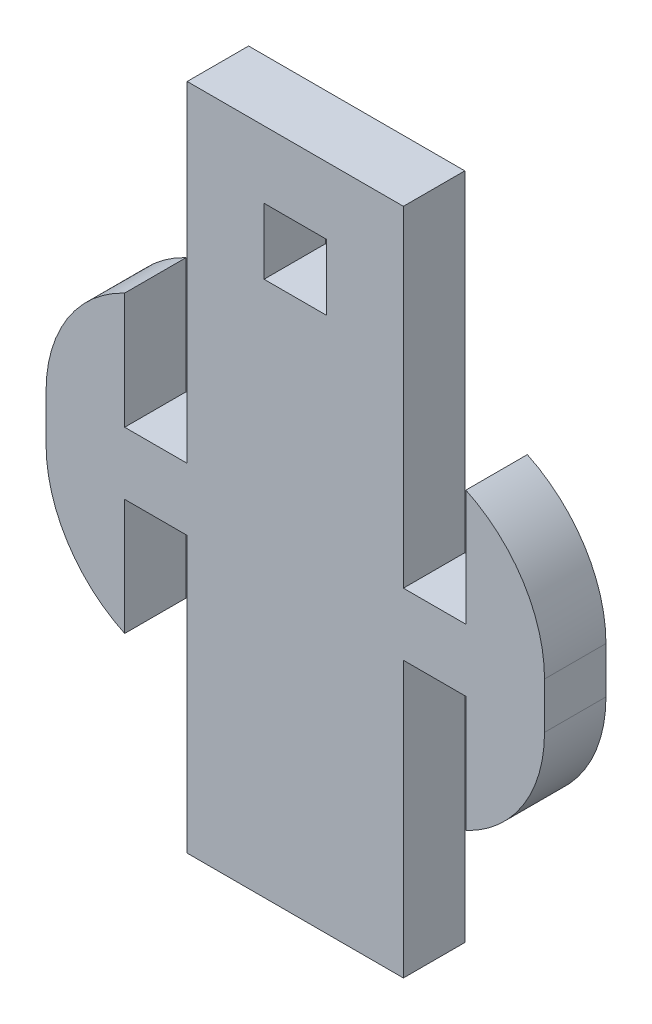
ISO-10303-21;
HEADER;
FILE_DESCRIPTION(('STEP AP214'),'2;1');
FILE_NAME('part.step','',(''),(''),'','','');
FILE_SCHEMA(('AUTOMOTIVE_DESIGN { 1 0 10303 214 1 1 1 1 }'));
ENDSEC;
DATA;
#1=APPLICATION_CONTEXT('core data for automotive mechanical design processes');
#2=APPLICATION_PROTOCOL_DEFINITION('international standard','automotive_design',2000,#1);
#3=PRODUCT_CONTEXT('',#1,'mechanical');
#4=PRODUCT('Part','Part','',(#3));
#5=PRODUCT_RELATED_PRODUCT_CATEGORY('part','',(#4));
#6=PRODUCT_DEFINITION_FORMATION('','',#4);
#7=PRODUCT_DEFINITION_CONTEXT('part definition',#1,'design');
#8=PRODUCT_DEFINITION('design','',#6,#7);
#9=PRODUCT_DEFINITION_SHAPE('','',#8);
#10=(LENGTH_UNIT() NAMED_UNIT(*) SI_UNIT(.MILLI.,.METRE.));
#11=(NAMED_UNIT(*) PLANE_ANGLE_UNIT() SI_UNIT($,.RADIAN.));
#12=(NAMED_UNIT(*) SI_UNIT($,.STERADIAN.) SOLID_ANGLE_UNIT());
#13=UNCERTAINTY_MEASURE_WITH_UNIT(LENGTH_MEASURE(1.E-05),#10,'distance_accuracy_value','');
#14=(GEOMETRIC_REPRESENTATION_CONTEXT(3) GLOBAL_UNCERTAINTY_ASSIGNED_CONTEXT((#13)) GLOBAL_UNIT_ASSIGNED_CONTEXT((#10,
#11,#12)) REPRESENTATION_CONTEXT('',''));
#15=CARTESIAN_POINT('',(0.,0.,0.));
#16=DIRECTION('',(0.,0.,1.));
#17=DIRECTION('',(1.,0.,0.));
#18=AXIS2_PLACEMENT_3D('',#15,#16,#17);
#19=CARTESIAN_POINT('',(0.,13.59,3.125));
#20=DIRECTION('',(0.,1.,0.));
#21=DIRECTION('',(0.,0.,1.));
#22=AXIS2_PLACEMENT_3D('',#19,#20,#21);
#23=PLANE('',#22);
#24=DIRECTION('',(1.,0.,0.));
#25=VECTOR('',#24,1.);
#26=CARTESIAN_POINT('',(0.,13.59,0.));
#27=LINE('',#26,#25);
#28=CARTESIAN_POINT('',(-1.59,13.59,0.));
#29=VERTEX_POINT('',#28);
#30=CARTESIAN_POINT('',(1.59,13.59,0.));
#31=VERTEX_POINT('',#30);
#32=EDGE_CURVE('E225',#29,#31,#27,.T.);
#33=ORIENTED_EDGE('',*,*,#32,.T.);
#34=DIRECTION('',(0.,0.,-1.));
#35=VECTOR('',#34,1.);
#36=CARTESIAN_POINT('',(1.59,13.59,3.125));
#37=LINE('',#36,#35);
#38=CARTESIAN_POINT('',(1.59,13.59,3.125));
#39=VERTEX_POINT('',#38);
#40=EDGE_CURVE('E422',#39,#31,#37,.T.);
#41=ORIENTED_EDGE('',*,*,#40,.F.);
#42=DIRECTION('',(1.,0.,0.));
#43=VECTOR('',#42,1.);
#44=CARTESIAN_POINT('',(0.,13.59,3.125));
#45=LINE('',#44,#43);
#46=CARTESIAN_POINT('',(-1.59,13.59,3.125));
#47=VERTEX_POINT('',#46);
#48=EDGE_CURVE('E321',#47,#39,#45,.T.);
#49=ORIENTED_EDGE('',*,*,#48,.F.);
#50=DIRECTION('',(0.,0.,-1.));
#51=VECTOR('',#50,1.);
#52=CARTESIAN_POINT('',(-1.59,13.59,3.125));
#53=LINE('',#52,#51);
#54=EDGE_CURVE('E264',#47,#29,#53,.T.);
#55=ORIENTED_EDGE('',*,*,#54,.T.);
#56=EDGE_LOOP('',(#33,#41,#49,#55));
#57=FACE_BOUND('',#56,.T.);
#58=ADVANCED_FACE('F39',(#57),#23,.F.);
#59=CARTESIAN_POINT('',(1.59,13.59,3.125));
#60=DIRECTION('',(1.,0.,0.));
#61=DIRECTION('',(0.,1.,0.));
#62=AXIS2_PLACEMENT_3D('',#59,#60,#61);
#63=PLANE('',#62);
#64=DIRECTION('',(0.,-1.,0.));
#65=VECTOR('',#64,1.);
#66=CARTESIAN_POINT('',(1.59,13.59,0.));
#67=LINE('',#66,#65);
#68=CARTESIAN_POINT('',(1.59,10.2412103984599,0.));
#69=VERTEX_POINT('',#68);
#70=EDGE_CURVE('E355',#31,#69,#67,.T.);
#71=ORIENTED_EDGE('',*,*,#70,.T.);
#72=DIRECTION('',(0.,0.,-1.));
#73=VECTOR('',#72,1.);
#74=CARTESIAN_POINT('',(1.59,10.2412103984599,3.125));
#75=LINE('',#74,#73);
#76=CARTESIAN_POINT('',(1.59,10.2412103984599,3.125));
#77=VERTEX_POINT('',#76);
#78=EDGE_CURVE('E418',#77,#69,#75,.T.);
#79=ORIENTED_EDGE('',*,*,#78,.F.);
#80=DIRECTION('',(0.,-1.,0.));
#81=VECTOR('',#80,1.);
#82=CARTESIAN_POINT('',(1.59,13.59,3.125));
#83=LINE('',#82,#81);
#84=EDGE_CURVE('E324',#39,#77,#83,.T.);
#85=ORIENTED_EDGE('',*,*,#84,.F.);
#86=ORIENTED_EDGE('',*,*,#40,.T.);
#87=EDGE_LOOP('',(#71,#79,#85,#86));
#88=FACE_BOUND('',#87,.T.);
#89=ADVANCED_FACE('F539',(#88),#63,.F.);
#90=CARTESIAN_POINT('',(1.59,10.2412103984599,3.125));
#91=DIRECTION('',(0.,-1.,0.));
#92=DIRECTION('',(0.,0.,-1.));
#93=AXIS2_PLACEMENT_3D('',#90,#91,#92);
#94=PLANE('',#93);
#95=DIRECTION('',(-1.,0.,0.));
#96=VECTOR('',#95,1.);
#97=CARTESIAN_POINT('',(1.59,10.2412103984599,0.));
#98=LINE('',#97,#96);
#99=CARTESIAN_POINT('',(-1.59,10.2412103984599,0.));
#100=VERTEX_POINT('',#99);
#101=EDGE_CURVE('E358',#69,#100,#98,.T.);
#102=ORIENTED_EDGE('',*,*,#101,.T.);
#103=DIRECTION('',(0.,0.,-1.));
#104=VECTOR('',#103,1.);
#105=CARTESIAN_POINT('',(-1.59,10.2412103984599,3.125));
#106=LINE('',#105,#104);
#107=CARTESIAN_POINT('',(-1.59,10.2412103984599,3.125));
#108=VERTEX_POINT('',#107);
#109=EDGE_CURVE('E294',#108,#100,#106,.T.);
#110=ORIENTED_EDGE('',*,*,#109,.F.);
#111=DIRECTION('',(-1.,0.,0.));
#112=VECTOR('',#111,1.);
#113=CARTESIAN_POINT('',(1.59,10.2412103984599,3.125));
#114=LINE('',#113,#112);
#115=EDGE_CURVE('E327',#77,#108,#114,.T.);
#116=ORIENTED_EDGE('',*,*,#115,.F.);
#117=ORIENTED_EDGE('',*,*,#78,.T.);
#118=EDGE_LOOP('',(#102,#110,#116,#117));
#119=FACE_BOUND('',#118,.T.);
#120=ADVANCED_FACE('F545',(#119),#94,.F.);
#121=CARTESIAN_POINT('',(5.5,-17.,3.125));
#122=DIRECTION('',(0.,1.,0.));
#123=DIRECTION('',(0.,0.,1.));
#124=AXIS2_PLACEMENT_3D('',#121,#122,#123);
#125=PLANE('',#124);
#126=DIRECTION('',(1.,0.,0.));
#127=VECTOR('',#126,1.);
#128=CARTESIAN_POINT('',(5.5,-17.,0.));
#129=LINE('',#128,#127);
#130=CARTESIAN_POINT('',(-5.49999999999999,-17.,0.));
#131=VERTEX_POINT('',#130);
#132=CARTESIAN_POINT('',(5.5,-17.,0.));
#133=VERTEX_POINT('',#132);
#134=EDGE_CURVE('E361',#131,#133,#129,.T.);
#135=ORIENTED_EDGE('',*,*,#134,.T.);
#136=DIRECTION('',(0.,0.,-1.));
#137=VECTOR('',#136,1.);
#138=CARTESIAN_POINT('',(5.5,-17.,3.125));
#139=LINE('',#138,#137);
#140=CARTESIAN_POINT('',(5.5,-17.,3.125));
#141=VERTEX_POINT('',#140);
#142=EDGE_CURVE('E414',#141,#133,#139,.T.);
#143=ORIENTED_EDGE('',*,*,#142,.F.);
#144=DIRECTION('',(1.,0.,0.));
#145=VECTOR('',#144,1.);
#146=CARTESIAN_POINT('',(5.5,-17.,3.125));
#147=LINE('',#146,#145);
#148=CARTESIAN_POINT('',(-5.49999999999999,-17.,3.125));
#149=VERTEX_POINT('',#148);
#150=EDGE_CURVE('E330',#149,#141,#147,.T.);
#151=ORIENTED_EDGE('',*,*,#150,.F.);
#152=DIRECTION('',(0.,0.,-1.));
#153=VECTOR('',#152,1.);
#154=CARTESIAN_POINT('',(-5.49999999999999,-17.,3.125));
#155=LINE('',#154,#153);
#156=EDGE_CURVE('E298',#149,#131,#155,.T.);
#157=ORIENTED_EDGE('',*,*,#156,.T.);
#158=EDGE_LOOP('',(#135,#143,#151,#157));
#159=FACE_BOUND('',#158,.T.);
#160=ADVANCED_FACE('F520',(#159),#125,.F.);
#161=CARTESIAN_POINT('',(5.5,-3.00000000000001,3.125));
#162=DIRECTION('',(-1.,0.,0.));
#163=DIRECTION('',(0.,-1.,0.));
#164=AXIS2_PLACEMENT_3D('',#161,#162,#163);
#165=PLANE('',#164);
#166=DIRECTION('',(0.,1.,0.));
#167=VECTOR('',#166,1.);
#168=CARTESIAN_POINT('',(5.5,-3.00000000000001,0.));
#169=LINE('',#168,#167);
#170=CARTESIAN_POINT('',(5.5,-3.00000000000001,0.));
#171=VERTEX_POINT('',#170);
#172=EDGE_CURVE('E364',#133,#171,#169,.T.);
#173=ORIENTED_EDGE('',*,*,#172,.T.);
#174=DIRECTION('',(0.,0.,-1.));
#175=VECTOR('',#174,1.);
#176=CARTESIAN_POINT('',(5.5,-3.00000000000001,3.125));
#177=LINE('',#176,#175);
#178=CARTESIAN_POINT('',(5.5,-3.00000000000001,3.125));
#179=VERTEX_POINT('',#178);
#180=EDGE_CURVE('E410',#179,#171,#177,.T.);
#181=ORIENTED_EDGE('',*,*,#180,.F.);
#182=DIRECTION('',(0.,1.,0.));
#183=VECTOR('',#182,1.);
#184=CARTESIAN_POINT('',(5.5,-3.00000000000001,3.125));
#185=LINE('',#184,#183);
#186=EDGE_CURVE('E333',#141,#179,#185,.T.);
#187=ORIENTED_EDGE('',*,*,#186,.F.);
#188=ORIENTED_EDGE('',*,*,#142,.T.);
#189=EDGE_LOOP('',(#173,#181,#187,#188));
#190=FACE_BOUND('',#189,.T.);
#191=ADVANCED_FACE('F516',(#190),#165,.F.);
#192=CARTESIAN_POINT('',(8.68,-3.00000000000001,3.125));
#193=DIRECTION('',(0.,1.,0.));
#194=DIRECTION('',(0.,0.,1.));
#195=AXIS2_PLACEMENT_3D('',#192,#193,#194);
#196=PLANE('',#195);
#197=DIRECTION('',(1.,0.,0.));
#198=VECTOR('',#197,1.);
#199=CARTESIAN_POINT('',(8.68,-3.00000000000001,0.));
#200=LINE('',#199,#198);
#201=CARTESIAN_POINT('',(8.68,-3.00000000000001,0.));
#202=VERTEX_POINT('',#201);
#203=EDGE_CURVE('E367',#171,#202,#200,.T.);
#204=ORIENTED_EDGE('',*,*,#203,.T.);
#205=DIRECTION('',(0.,0.,-1.));
#206=VECTOR('',#205,1.);
#207=CARTESIAN_POINT('',(8.68,-3.00000000000001,3.125));
#208=LINE('',#207,#206);
#209=CARTESIAN_POINT('',(8.68,-3.00000000000001,3.125));
#210=VERTEX_POINT('',#209);
#211=EDGE_CURVE('E406',#210,#202,#208,.T.);
#212=ORIENTED_EDGE('',*,*,#211,.F.);
#213=DIRECTION('',(1.,0.,0.));
#214=VECTOR('',#213,1.);
#215=CARTESIAN_POINT('',(8.68,-3.00000000000001,3.125));
#216=LINE('',#215,#214);
#217=EDGE_CURVE('E336',#179,#210,#216,.T.);
#218=ORIENTED_EDGE('',*,*,#217,.F.);
#219=ORIENTED_EDGE('',*,*,#180,.T.);
#220=EDGE_LOOP('',(#204,#212,#218,#219));
#221=FACE_BOUND('',#220,.T.);
#222=ADVANCED_FACE('F512',(#221),#196,.F.);
#223=CARTESIAN_POINT('',(8.68,-8.91249999999999,3.125));
#224=DIRECTION('',(1.,0.,0.));
#225=DIRECTION('',(0.,0.,-1.));
#226=AXIS2_PLACEMENT_3D('',#223,#224,#225);
#227=PLANE('',#226);
#228=DIRECTION('',(0.,-1.,0.));
#229=VECTOR('',#228,1.);
#230=CARTESIAN_POINT('',(8.68,-8.91249999999999,0.));
#231=LINE('',#230,#229);
#232=CARTESIAN_POINT('',(8.68,-8.91249999999999,0.));
#233=VERTEX_POINT('',#232);
#234=EDGE_CURVE('E370',#202,#233,#231,.T.);
#235=ORIENTED_EDGE('',*,*,#234,.T.);
#236=DIRECTION('',(0.,0.,-1.));
#237=VECTOR('',#236,1.);
#238=CARTESIAN_POINT('',(8.68,-8.91249999999999,3.125));
#239=LINE('',#238,#237);
#240=CARTESIAN_POINT('',(8.68,-8.91249999999999,3.125));
#241=VERTEX_POINT('',#240);
#242=EDGE_CURVE('E402',#241,#233,#239,.T.);
#243=ORIENTED_EDGE('',*,*,#242,.F.);
#244=DIRECTION('',(0.,-1.,0.));
#245=VECTOR('',#244,1.);
#246=CARTESIAN_POINT('',(8.68,-8.91249999999999,3.125));
#247=LINE('',#246,#245);
#248=EDGE_CURVE('E339',#210,#241,#247,.T.);
#249=ORIENTED_EDGE('',*,*,#248,.F.);
#250=ORIENTED_EDGE('',*,*,#211,.T.);
#251=EDGE_LOOP('',(#235,#243,#249,#250));
#252=FACE_BOUND('',#251,.T.);
#253=ADVANCED_FACE('F507',(#252),#227,.F.);
#254=CARTESIAN_POINT('',(12.68,6.08750000000001,3.125));
#255=DIRECTION('',(-1.,0.,0.));
#256=DIRECTION('',(0.,-1.,0.));
#257=AXIS2_PLACEMENT_3D('',#254,#255,#256);
#258=PLANE('',#257);
#259=DIRECTION('',(0.,1.,0.));
#260=VECTOR('',#259,1.);
#261=CARTESIAN_POINT('',(12.68,6.08750000000001,3.125));
#262=LINE('',#261,#260);
#263=CARTESIAN_POINT('',(12.68,-2.58794467966323,3.125));
#264=VERTEX_POINT('',#263);
#265=CARTESIAN_POINT('',(12.68,-0.237055320336743,3.125));
#266=VERTEX_POINT('',#265);
#267=EDGE_CURVE('E342',#264,#266,#262,.T.);
#268=ORIENTED_EDGE('',*,*,#267,.F.);
#269=DIRECTION('',(0.,0.,-1.));
#270=VECTOR('',#269,1.);
#271=CARTESIAN_POINT('',(12.68,-2.58794467966323,3.125));
#272=LINE('',#271,#270);
#273=CARTESIAN_POINT('',(12.68,-2.58794467966323,0.));
#274=VERTEX_POINT('',#273);
#275=EDGE_CURVE('E11',#264,#274,#272,.T.);
#276=ORIENTED_EDGE('',*,*,#275,.T.);
#277=DIRECTION('',(0.,1.,0.));
#278=VECTOR('',#277,1.);
#279=CARTESIAN_POINT('',(12.68,6.08750000000001,0.));
#280=LINE('',#279,#278);
#281=CARTESIAN_POINT('',(12.68,-0.237055320336743,0.));
#282=VERTEX_POINT('',#281);
#283=EDGE_CURVE('E374',#274,#282,#280,.T.);
#284=ORIENTED_EDGE('',*,*,#283,.T.);
#285=DIRECTION('',(0.,0.,1.));
#286=VECTOR('',#285,1.);
#287=CARTESIAN_POINT('',(12.68,-0.237055320336743,3.125));
#288=LINE('',#287,#286);
#289=EDGE_CURVE('E48',#282,#266,#288,.T.);
#290=ORIENTED_EDGE('',*,*,#289,.T.);
#291=EDGE_LOOP('',(#268,#276,#284,#290));
#292=FACE_BOUND('',#291,.T.);
#293=ADVANCED_FACE('F498',(#292),#258,.F.);
#294=CARTESIAN_POINT('',(8.68,0.175000000000015,3.125));
#295=DIRECTION('',(1.,0.,0.));
#296=DIRECTION('',(0.,0.,-1.));
#297=AXIS2_PLACEMENT_3D('',#294,#295,#296);
#298=PLANE('',#297);
#299=DIRECTION('',(0.,-1.,0.));
#300=VECTOR('',#299,1.);
#301=CARTESIAN_POINT('',(8.68,0.175000000000015,0.));
#302=LINE('',#301,#300);
#303=CARTESIAN_POINT('',(8.68,6.08750000000001,0.));
#304=VERTEX_POINT('',#303);
#305=CARTESIAN_POINT('',(8.68,0.175000000000015,0.));
#306=VERTEX_POINT('',#305);
#307=EDGE_CURVE('E377',#304,#306,#302,.T.);
#308=ORIENTED_EDGE('',*,*,#307,.T.);
#309=DIRECTION('',(0.,0.,-1.));
#310=VECTOR('',#309,1.);
#311=CARTESIAN_POINT('',(8.68,0.175000000000015,3.125));
#312=LINE('',#311,#310);
#313=CARTESIAN_POINT('',(8.68,0.175000000000015,3.125));
#314=VERTEX_POINT('',#313);
#315=EDGE_CURVE('E394',#314,#306,#312,.T.);
#316=ORIENTED_EDGE('',*,*,#315,.F.);
#317=DIRECTION('',(0.,-1.,0.));
#318=VECTOR('',#317,1.);
#319=CARTESIAN_POINT('',(8.68,0.175000000000015,3.125));
#320=LINE('',#319,#318);
#321=CARTESIAN_POINT('',(8.68,6.08750000000001,3.125));
#322=VERTEX_POINT('',#321);
#323=EDGE_CURVE('E345',#322,#314,#320,.T.);
#324=ORIENTED_EDGE('',*,*,#323,.F.);
#325=DIRECTION('',(0.,0.,-1.));
#326=VECTOR('',#325,1.);
#327=CARTESIAN_POINT('',(8.68,6.08750000000001,3.125));
#328=LINE('',#327,#326);
#329=EDGE_CURVE('E398',#322,#304,#328,.T.);
#330=ORIENTED_EDGE('',*,*,#329,.T.);
#331=EDGE_LOOP('',(#308,#316,#324,#330));
#332=FACE_BOUND('',#331,.T.);
#333=ADVANCED_FACE('F494',(#332),#298,.F.);
#334=CARTESIAN_POINT('',(5.5,0.175000000000015,3.125));
#335=DIRECTION('',(0.,-1.,0.));
#336=DIRECTION('',(0.,0.,-1.));
#337=AXIS2_PLACEMENT_3D('',#334,#335,#336);
#338=PLANE('',#337);
#339=DIRECTION('',(-1.,0.,0.));
#340=VECTOR('',#339,1.);
#341=CARTESIAN_POINT('',(5.5,0.175000000000015,0.));
#342=LINE('',#341,#340);
#343=CARTESIAN_POINT('',(5.5,0.175000000000015,0.));
#344=VERTEX_POINT('',#343);
#345=EDGE_CURVE('E380',#306,#344,#342,.T.);
#346=ORIENTED_EDGE('',*,*,#345,.T.);
#347=DIRECTION('',(0.,0.,-1.));
#348=VECTOR('',#347,1.);
#349=CARTESIAN_POINT('',(5.5,0.175000000000015,3.125));
#350=LINE('',#349,#348);
#351=CARTESIAN_POINT('',(5.5,0.175000000000015,3.125));
#352=VERTEX_POINT('',#351);
#353=EDGE_CURVE('E390',#352,#344,#350,.T.);
#354=ORIENTED_EDGE('',*,*,#353,.F.);
#355=DIRECTION('',(-1.,0.,0.));
#356=VECTOR('',#355,1.);
#357=CARTESIAN_POINT('',(5.5,0.175000000000015,3.125));
#358=LINE('',#357,#356);
#359=EDGE_CURVE('E348',#314,#352,#358,.T.);
#360=ORIENTED_EDGE('',*,*,#359,.F.);
#361=ORIENTED_EDGE('',*,*,#315,.T.);
#362=EDGE_LOOP('',(#346,#354,#360,#361));
#363=FACE_BOUND('',#362,.T.);
#364=ADVANCED_FACE('F490',(#363),#338,.F.);
#365=CARTESIAN_POINT('',(5.5,17.,3.125));
#366=DIRECTION('',(-1.,0.,0.));
#367=DIRECTION('',(0.,-1.,0.));
#368=AXIS2_PLACEMENT_3D('',#365,#366,#367);
#369=PLANE('',#368);
#370=DIRECTION('',(0.,1.,0.));
#371=VECTOR('',#370,1.);
#372=CARTESIAN_POINT('',(5.5,17.,0.));
#373=LINE('',#372,#371);
#374=CARTESIAN_POINT('',(5.5,17.,0.));
#375=VERTEX_POINT('',#374);
#376=EDGE_CURVE('E383',#344,#375,#373,.T.);
#377=ORIENTED_EDGE('',*,*,#376,.T.);
#378=DIRECTION('',(0.,0.,-1.));
#379=VECTOR('',#378,1.);
#380=CARTESIAN_POINT('',(5.5,17.,3.125));
#381=LINE('',#380,#379);
#382=CARTESIAN_POINT('',(5.5,17.,3.125));
#383=VERTEX_POINT('',#382);
#384=EDGE_CURVE('E214',#383,#375,#381,.T.);
#385=ORIENTED_EDGE('',*,*,#384,.F.);
#386=DIRECTION('',(0.,1.,0.));
#387=VECTOR('',#386,1.);
#388=CARTESIAN_POINT('',(5.5,17.,3.125));
#389=LINE('',#388,#387);
#390=EDGE_CURVE('E209',#352,#383,#389,.T.);
#391=ORIENTED_EDGE('',*,*,#390,.F.);
#392=ORIENTED_EDGE('',*,*,#353,.T.);
#393=EDGE_LOOP('',(#377,#385,#391,#392));
#394=FACE_BOUND('',#393,.T.);
#395=ADVANCED_FACE('F486',(#394),#369,.F.);
#396=CARTESIAN_POINT('',(0.,17.,3.125));
#397=DIRECTION('',(0.,-1.,0.));
#398=DIRECTION('',(1.,0.,0.));
#399=AXIS2_PLACEMENT_3D('',#396,#397,#398);
#400=PLANE('',#399);
#401=DIRECTION('',(-1.,0.,0.));
#402=VECTOR('',#401,1.);
#403=CARTESIAN_POINT('',(0.,17.,0.));
#404=LINE('',#403,#402);
#405=CARTESIAN_POINT('',(-5.50000000000001,17.,0.));
#406=VERTEX_POINT('',#405);
#407=EDGE_CURVE('E220',#375,#406,#404,.T.);
#408=ORIENTED_EDGE('',*,*,#407,.T.);
#409=DIRECTION('',(0.,0.,-1.));
#410=VECTOR('',#409,1.);
#411=CARTESIAN_POINT('',(-5.50000000000001,17.,3.125));
#412=LINE('',#411,#410);
#413=CARTESIAN_POINT('',(-5.50000000000001,17.,3.125));
#414=VERTEX_POINT('',#413);
#415=EDGE_CURVE('E217',#414,#406,#412,.T.);
#416=ORIENTED_EDGE('',*,*,#415,.F.);
#417=DIRECTION('',(-1.,0.,0.));
#418=VECTOR('',#417,1.);
#419=CARTESIAN_POINT('',(0.,17.,3.125));
#420=LINE('',#419,#418);
#421=EDGE_CURVE('E200',#383,#414,#420,.T.);
#422=ORIENTED_EDGE('',*,*,#421,.F.);
#423=ORIENTED_EDGE('',*,*,#384,.T.);
#424=EDGE_LOOP('',(#408,#416,#422,#423));
#425=FACE_BOUND('',#424,.T.);
#426=ADVANCED_FACE('F218',(#425),#400,.F.);
#427=CARTESIAN_POINT('',(0.,0.,3.125));
#428=DIRECTION('',(0.,0.,1.));
#429=DIRECTION('',(1.,0.,0.));
#430=AXIS2_PLACEMENT_3D('',#427,#428,#429);
#431=PLANE('',#430);
#432=DIRECTION('',(0.,-1.,0.));
#433=VECTOR('',#432,1.);
#434=CARTESIAN_POINT('',(-1.59,13.59,3.125));
#435=LINE('',#434,#433);
#436=EDGE_CURVE('E260',#47,#108,#435,.T.);
#437=ORIENTED_EDGE('',*,*,#436,.F.);
#438=ORIENTED_EDGE('',*,*,#48,.T.);
#439=ORIENTED_EDGE('',*,*,#84,.T.);
#440=ORIENTED_EDGE('',*,*,#115,.T.);
#441=EDGE_LOOP('',(#437,#438,#439,#440));
#442=FACE_BOUND('',#441,.T.);
#443=DIRECTION('',(0.,1.,0.));
#444=VECTOR('',#443,1.);
#445=CARTESIAN_POINT('',(-12.68,6.08750000000001,3.125));
#446=LINE('',#445,#444);
#447=CARTESIAN_POINT('',(-12.68,-2.58794467966323,3.125));
#448=VERTEX_POINT('',#447);
#449=CARTESIAN_POINT('',(-12.68,-0.237055320336751,3.125));
#450=VERTEX_POINT('',#449);
#451=EDGE_CURVE('E244',#448,#450,#446,.T.);
#452=ORIENTED_EDGE('',*,*,#451,.F.);
#453=CARTESIAN_POINT('',(-5.67999999999999,-2.58794467966323,3.125));
#454=DIRECTION('',(0.,0.,1.));
#455=DIRECTION('',(1.,0.,0.));
#456=AXIS2_PLACEMENT_3D('',#453,#454,#455);
#457=CIRCLE('',#456,7.);
#458=CARTESIAN_POINT('',(-8.67999999999999,-8.91249999999999,3.125));
#459=VERTEX_POINT('',#458);
#460=EDGE_CURVE('E453',#448,#459,#457,.T.);
#461=ORIENTED_EDGE('',*,*,#460,.T.);
#462=DIRECTION('',(0.,-1.,0.));
#463=VECTOR('',#462,1.);
#464=CARTESIAN_POINT('',(-8.67999999999999,-8.91249999999999,3.125));
#465=LINE('',#464,#463);
#466=CARTESIAN_POINT('',(-8.67999999999999,-3.00000000000002,3.125));
#467=VERTEX_POINT('',#466);
#468=EDGE_CURVE('E248',#467,#459,#465,.T.);
#469=ORIENTED_EDGE('',*,*,#468,.F.);
#470=DIRECTION('',(-1.,0.,0.));
#471=VECTOR('',#470,1.);
#472=CARTESIAN_POINT('',(-8.67999999999999,-3.00000000000002,3.125));
#473=LINE('',#472,#471);
#474=CARTESIAN_POINT('',(-5.5,-3.00000000000002,3.125));
#475=VERTEX_POINT('',#474);
#476=EDGE_CURVE('E252',#475,#467,#473,.T.);
#477=ORIENTED_EDGE('',*,*,#476,.F.);
#478=DIRECTION('',(0.,1.,0.));
#479=VECTOR('',#478,1.);
#480=CARTESIAN_POINT('',(-5.5,-3.00000000000002,3.125));
#481=LINE('',#480,#479);
#482=EDGE_CURVE('E256',#149,#475,#481,.T.);
#483=ORIENTED_EDGE('',*,*,#482,.F.);
#484=ORIENTED_EDGE('',*,*,#150,.T.);
#485=ORIENTED_EDGE('',*,*,#186,.T.);
#486=ORIENTED_EDGE('',*,*,#217,.T.);
#487=ORIENTED_EDGE('',*,*,#248,.T.);
#488=CARTESIAN_POINT('',(5.68,-2.58794467966323,3.125));
#489=DIRECTION('',(0.,0.,1.));
#490=DIRECTION('',(1.,0.,0.));
#491=AXIS2_PLACEMENT_3D('',#488,#489,#490);
#492=CIRCLE('',#491,7.);
#493=EDGE_CURVE('E61',#241,#264,#492,.T.);
#494=ORIENTED_EDGE('',*,*,#493,.T.);
#495=ORIENTED_EDGE('',*,*,#267,.T.);
#496=CARTESIAN_POINT('',(5.68,-0.237055320336744,3.125));
#497=DIRECTION('',(0.,0.,1.));
#498=DIRECTION('',(1.,0.,0.));
#499=AXIS2_PLACEMENT_3D('',#496,#497,#498);
#500=CIRCLE('',#499,7.);
#501=EDGE_CURVE('E445',#266,#322,#500,.T.);
#502=ORIENTED_EDGE('',*,*,#501,.T.);
#503=ORIENTED_EDGE('',*,*,#323,.T.);
#504=ORIENTED_EDGE('',*,*,#359,.T.);
#505=ORIENTED_EDGE('',*,*,#390,.T.);
#506=ORIENTED_EDGE('',*,*,#421,.T.);
#507=DIRECTION('',(0.,1.,0.));
#508=VECTOR('',#507,1.);
#509=CARTESIAN_POINT('',(-5.50000000000001,17.,3.125));
#510=LINE('',#509,#508);
#511=CARTESIAN_POINT('',(-5.5,0.175000000000012,3.125));
#512=VERTEX_POINT('',#511);
#513=EDGE_CURVE('E206',#512,#414,#510,.T.);
#514=ORIENTED_EDGE('',*,*,#513,.F.);
#515=DIRECTION('',(1.,0.,0.));
#516=VECTOR('',#515,1.);
#517=CARTESIAN_POINT('',(-5.5,0.175000000000012,3.125));
#518=LINE('',#517,#516);
#519=CARTESIAN_POINT('',(-8.68,0.17500000000001,3.125));
#520=VERTEX_POINT('',#519);
#521=EDGE_CURVE('E230',#520,#512,#518,.T.);
#522=ORIENTED_EDGE('',*,*,#521,.F.);
#523=DIRECTION('',(0.,-1.,0.));
#524=VECTOR('',#523,1.);
#525=CARTESIAN_POINT('',(-8.68,0.17500000000001,3.125));
#526=LINE('',#525,#524);
#527=CARTESIAN_POINT('',(-8.68,6.08750000000001,3.125));
#528=VERTEX_POINT('',#527);
#529=EDGE_CURVE('E235',#528,#520,#526,.T.);
#530=ORIENTED_EDGE('',*,*,#529,.F.);
#531=CARTESIAN_POINT('',(-5.68,-0.237055320336747,3.125));
#532=DIRECTION('',(0.,0.,1.));
#533=DIRECTION('',(1.,0.,0.));
#534=AXIS2_PLACEMENT_3D('',#531,#532,#533);
#535=CIRCLE('',#534,7.);
#536=EDGE_CURVE('E450',#528,#450,#535,.T.);
#537=ORIENTED_EDGE('',*,*,#536,.T.);
#538=EDGE_LOOP('',(#452,#461,#469,#477,#483,#484,#485,#486,#487,#494,#495,#502,#503,#504,#505,
#506,#514,#522,#530,#537));
#539=FACE_BOUND('',#538,.T.);
#540=ADVANCED_FACE('F203',(#442,#539),#431,.T.);
#541=CARTESIAN_POINT('',(0.,0.,0.));
#542=DIRECTION('',(0.,0.,1.));
#543=DIRECTION('',(1.,0.,0.));
#544=AXIS2_PLACEMENT_3D('',#541,#542,#543);
#545=PLANE('',#544);
#546=ORIENTED_EDGE('',*,*,#32,.F.);
#547=DIRECTION('',(0.,-1.,0.));
#548=VECTOR('',#547,1.);
#549=CARTESIAN_POINT('',(-1.59,13.59,0.));
#550=LINE('',#549,#548);
#551=EDGE_CURVE('E231',#29,#100,#550,.T.);
#552=ORIENTED_EDGE('',*,*,#551,.T.);
#553=ORIENTED_EDGE('',*,*,#101,.F.);
#554=ORIENTED_EDGE('',*,*,#70,.F.);
#555=EDGE_LOOP('',(#546,#552,#553,#554));
#556=FACE_BOUND('',#555,.T.);
#557=DIRECTION('',(0.,-1.,0.));
#558=VECTOR('',#557,1.);
#559=CARTESIAN_POINT('',(-8.67999999999999,-8.91249999999999,0.));
#560=LINE('',#559,#558);
#561=CARTESIAN_POINT('',(-8.67999999999999,-3.00000000000002,0.));
#562=VERTEX_POINT('',#561);
#563=CARTESIAN_POINT('',(-8.67999999999999,-8.91249999999999,0.));
#564=VERTEX_POINT('',#563);
#565=EDGE_CURVE('E280',#562,#564,#560,.T.);
#566=ORIENTED_EDGE('',*,*,#565,.T.);
#567=CARTESIAN_POINT('',(-5.67999999999999,-2.58794467966323,0.));
#568=DIRECTION('',(0.,0.,1.));
#569=DIRECTION('',(1.,0.,0.));
#570=AXIS2_PLACEMENT_3D('',#567,#568,#569);
#571=CIRCLE('',#570,7.);
#572=CARTESIAN_POINT('',(-12.68,-2.58794467966323,0.));
#573=VERTEX_POINT('',#572);
#574=EDGE_CURVE('E435',#564,#573,#571,.F.);
#575=ORIENTED_EDGE('',*,*,#574,.T.);
#576=DIRECTION('',(0.,1.,0.));
#577=VECTOR('',#576,1.);
#578=CARTESIAN_POINT('',(-12.68,6.08750000000001,0.));
#579=LINE('',#578,#577);
#580=CARTESIAN_POINT('',(-12.68,-0.237055320336751,0.));
#581=VERTEX_POINT('',#580);
#582=EDGE_CURVE('E276',#573,#581,#579,.T.);
#583=ORIENTED_EDGE('',*,*,#582,.T.);
#584=CARTESIAN_POINT('',(-5.68,-0.237055320336747,0.));
#585=DIRECTION('',(0.,0.,1.));
#586=DIRECTION('',(1.,0.,0.));
#587=AXIS2_PLACEMENT_3D('',#584,#585,#586);
#588=CIRCLE('',#587,7.);
#589=CARTESIAN_POINT('',(-8.68,6.08750000000001,0.));
#590=VERTEX_POINT('',#589);
#591=EDGE_CURVE('E432',#581,#590,#588,.F.);
#592=ORIENTED_EDGE('',*,*,#591,.T.);
#593=DIRECTION('',(0.,-1.,0.));
#594=VECTOR('',#593,1.);
#595=CARTESIAN_POINT('',(-8.68,0.17500000000001,0.));
#596=LINE('',#595,#594);
#597=CARTESIAN_POINT('',(-8.68,0.17500000000001,0.));
#598=VERTEX_POINT('',#597);
#599=EDGE_CURVE('E272',#590,#598,#596,.T.);
#600=ORIENTED_EDGE('',*,*,#599,.T.);
#601=DIRECTION('',(1.,0.,0.));
#602=VECTOR('',#601,1.);
#603=CARTESIAN_POINT('',(-5.5,0.175000000000012,0.));
#604=LINE('',#603,#602);
#605=CARTESIAN_POINT('',(-5.5,0.175000000000012,0.));
#606=VERTEX_POINT('',#605);
#607=EDGE_CURVE('E268',#598,#606,#604,.T.);
#608=ORIENTED_EDGE('',*,*,#607,.T.);
#609=DIRECTION('',(0.,1.,0.));
#610=VECTOR('',#609,1.);
#611=CARTESIAN_POINT('',(-5.50000000000001,17.,0.));
#612=LINE('',#611,#610);
#613=EDGE_CURVE('E265',#606,#406,#612,.T.);
#614=ORIENTED_EDGE('',*,*,#613,.T.);
#615=ORIENTED_EDGE('',*,*,#407,.F.);
#616=ORIENTED_EDGE('',*,*,#376,.F.);
#617=ORIENTED_EDGE('',*,*,#345,.F.);
#618=ORIENTED_EDGE('',*,*,#307,.F.);
#619=CARTESIAN_POINT('',(5.68,-0.237055320336744,0.));
#620=DIRECTION('',(0.,0.,1.));
#621=DIRECTION('',(1.,0.,0.));
#622=AXIS2_PLACEMENT_3D('',#619,#620,#621);
#623=CIRCLE('',#622,7.);
#624=EDGE_CURVE('E426',#304,#282,#623,.F.);
#625=ORIENTED_EDGE('',*,*,#624,.T.);
#626=ORIENTED_EDGE('',*,*,#283,.F.);
#627=CARTESIAN_POINT('',(5.68,-2.58794467966323,0.));
#628=DIRECTION('',(0.,0.,1.));
#629=DIRECTION('',(1.,0.,0.));
#630=AXIS2_PLACEMENT_3D('',#627,#628,#629);
#631=CIRCLE('',#630,7.);
#632=EDGE_CURVE('E429',#274,#233,#631,.F.);
#633=ORIENTED_EDGE('',*,*,#632,.T.);
#634=ORIENTED_EDGE('',*,*,#234,.F.);
#635=ORIENTED_EDGE('',*,*,#203,.F.);
#636=ORIENTED_EDGE('',*,*,#172,.F.);
#637=ORIENTED_EDGE('',*,*,#134,.F.);
#638=DIRECTION('',(0.,1.,0.));
#639=VECTOR('',#638,1.);
#640=CARTESIAN_POINT('',(-5.5,-3.00000000000002,0.));
#641=LINE('',#640,#639);
#642=CARTESIAN_POINT('',(-5.5,-3.00000000000002,0.));
#643=VERTEX_POINT('',#642);
#644=EDGE_CURVE('E238',#131,#643,#641,.T.);
#645=ORIENTED_EDGE('',*,*,#644,.T.);
#646=DIRECTION('',(-1.,0.,0.));
#647=VECTOR('',#646,1.);
#648=CARTESIAN_POINT('',(-8.67999999999999,-3.00000000000002,0.));
#649=LINE('',#648,#647);
#650=EDGE_CURVE('E284',#643,#562,#649,.T.);
#651=ORIENTED_EDGE('',*,*,#650,.T.);
#652=EDGE_LOOP('',(#566,#575,#583,#592,#600,#608,#614,#615,#616,#617,#618,#625,#626,#633,#634,
#635,#636,#637,#645,#651));
#653=FACE_BOUND('',#652,.T.);
#654=ADVANCED_FACE('F468',(#556,#653),#545,.F.);
#655=CARTESIAN_POINT('',(-5.50000000000001,17.,3.125));
#656=DIRECTION('',(-1.,0.,0.));
#657=DIRECTION('',(0.,-1.,0.));
#658=AXIS2_PLACEMENT_3D('',#655,#656,#657);
#659=PLANE('',#658);
#660=ORIENTED_EDGE('',*,*,#613,.F.);
#661=DIRECTION('',(0.,0.,-1.));
#662=VECTOR('',#661,1.);
#663=CARTESIAN_POINT('',(-5.5,0.175000000000012,3.125));
#664=LINE('',#663,#662);
#665=EDGE_CURVE('E226',#512,#606,#664,.T.);
#666=ORIENTED_EDGE('',*,*,#665,.F.);
#667=ORIENTED_EDGE('',*,*,#513,.T.);
#668=ORIENTED_EDGE('',*,*,#415,.T.);
#669=EDGE_LOOP('',(#660,#666,#667,#668));
#670=FACE_BOUND('',#669,.T.);
#671=ADVANCED_FACE('F228',(#670),#659,.T.);
#672=CARTESIAN_POINT('',(-5.5,0.175000000000012,3.125));
#673=DIRECTION('',(0.,1.,0.));
#674=DIRECTION('',(-1.,0.,0.));
#675=AXIS2_PLACEMENT_3D('',#672,#673,#674);
#676=PLANE('',#675);
#677=ORIENTED_EDGE('',*,*,#607,.F.);
#678=DIRECTION('',(0.,0.,-1.));
#679=VECTOR('',#678,1.);
#680=CARTESIAN_POINT('',(-8.68,0.17500000000001,3.125));
#681=LINE('',#680,#679);
#682=EDGE_CURVE('E316',#520,#598,#681,.T.);
#683=ORIENTED_EDGE('',*,*,#682,.F.);
#684=ORIENTED_EDGE('',*,*,#521,.T.);
#685=ORIENTED_EDGE('',*,*,#665,.T.);
#686=EDGE_LOOP('',(#677,#683,#684,#685));
#687=FACE_BOUND('',#686,.T.);
#688=ADVANCED_FACE('F481',(#687),#676,.T.);
#689=CARTESIAN_POINT('',(-8.68,0.17500000000001,3.125));
#690=DIRECTION('',(1.,0.,0.));
#691=DIRECTION('',(0.,1.,0.));
#692=AXIS2_PLACEMENT_3D('',#689,#690,#691);
#693=PLANE('',#692);
#694=ORIENTED_EDGE('',*,*,#599,.F.);
#695=DIRECTION('',(0.,0.,-1.));
#696=VECTOR('',#695,1.);
#697=CARTESIAN_POINT('',(-8.68,6.08750000000001,3.125));
#698=LINE('',#697,#696);
#699=EDGE_CURVE('E312',#528,#590,#698,.T.);
#700=ORIENTED_EDGE('',*,*,#699,.F.);
#701=ORIENTED_EDGE('',*,*,#529,.T.);
#702=ORIENTED_EDGE('',*,*,#682,.T.);
#703=EDGE_LOOP('',(#694,#700,#701,#702));
#704=FACE_BOUND('',#703,.T.);
#705=ADVANCED_FACE('F477',(#704),#693,.T.);
#706=CARTESIAN_POINT('',(-12.68,6.08750000000001,3.125));
#707=DIRECTION('',(-1.,0.,0.));
#708=DIRECTION('',(0.,-1.,0.));
#709=AXIS2_PLACEMENT_3D('',#706,#707,#708);
#710=PLANE('',#709);
#711=ORIENTED_EDGE('',*,*,#582,.F.);
#712=DIRECTION('',(0.,0.,-1.));
#713=VECTOR('',#712,1.);
#714=CARTESIAN_POINT('',(-12.68,-2.58794467966323,3.125));
#715=LINE('',#714,#713);
#716=EDGE_CURVE('E442',#573,#448,#715,.F.);
#717=ORIENTED_EDGE('',*,*,#716,.T.);
#718=ORIENTED_EDGE('',*,*,#451,.T.);
#719=DIRECTION('',(0.,0.,1.));
#720=VECTOR('',#719,1.);
#721=CARTESIAN_POINT('',(-12.68,-0.237055320336751,0.));
#722=LINE('',#721,#720);
#723=EDGE_CURVE('E438',#450,#581,#722,.F.);
#724=ORIENTED_EDGE('',*,*,#723,.T.);
#725=EDGE_LOOP('',(#711,#717,#718,#724));
#726=FACE_BOUND('',#725,.T.);
#727=ADVANCED_FACE('F470',(#726),#710,.T.);
#728=CARTESIAN_POINT('',(-8.67999999999999,-8.91249999999999,3.125));
#729=DIRECTION('',(1.,0.,0.));
#730=DIRECTION('',(0.,1.,0.));
#731=AXIS2_PLACEMENT_3D('',#728,#729,#730);
#732=PLANE('',#731);
#733=ORIENTED_EDGE('',*,*,#565,.F.);
#734=DIRECTION('',(0.,0.,-1.));
#735=VECTOR('',#734,1.);
#736=CARTESIAN_POINT('',(-8.67999999999999,-3.00000000000002,3.125));
#737=LINE('',#736,#735);
#738=EDGE_CURVE('E305',#467,#562,#737,.T.);
#739=ORIENTED_EDGE('',*,*,#738,.F.);
#740=ORIENTED_EDGE('',*,*,#468,.T.);
#741=DIRECTION('',(0.,0.,-1.));
#742=VECTOR('',#741,1.);
#743=CARTESIAN_POINT('',(-8.67999999999999,-8.91249999999999,3.125));
#744=LINE('',#743,#742);
#745=EDGE_CURVE('E308',#459,#564,#744,.T.);
#746=ORIENTED_EDGE('',*,*,#745,.T.);
#747=EDGE_LOOP('',(#733,#739,#740,#746));
#748=FACE_BOUND('',#747,.T.);
#749=ADVANCED_FACE('F464',(#748),#732,.T.);
#750=CARTESIAN_POINT('',(-8.67999999999999,-3.00000000000002,3.125));
#751=DIRECTION('',(0.,-1.,0.));
#752=DIRECTION('',(1.,0.,0.));
#753=AXIS2_PLACEMENT_3D('',#750,#751,#752);
#754=PLANE('',#753);
#755=ORIENTED_EDGE('',*,*,#650,.F.);
#756=DIRECTION('',(0.,0.,-1.));
#757=VECTOR('',#756,1.);
#758=CARTESIAN_POINT('',(-5.5,-3.00000000000002,3.125));
#759=LINE('',#758,#757);
#760=EDGE_CURVE('E302',#475,#643,#759,.T.);
#761=ORIENTED_EDGE('',*,*,#760,.F.);
#762=ORIENTED_EDGE('',*,*,#476,.T.);
#763=ORIENTED_EDGE('',*,*,#738,.T.);
#764=EDGE_LOOP('',(#755,#761,#762,#763));
#765=FACE_BOUND('',#764,.T.);
#766=ADVANCED_FACE('F528',(#765),#754,.T.);
#767=CARTESIAN_POINT('',(-5.5,-3.00000000000002,3.125));
#768=DIRECTION('',(-1.,0.,0.));
#769=DIRECTION('',(0.,-1.,0.));
#770=AXIS2_PLACEMENT_3D('',#767,#768,#769);
#771=PLANE('',#770);
#772=ORIENTED_EDGE('',*,*,#644,.F.);
#773=ORIENTED_EDGE('',*,*,#156,.F.);
#774=ORIENTED_EDGE('',*,*,#482,.T.);
#775=ORIENTED_EDGE('',*,*,#760,.T.);
#776=EDGE_LOOP('',(#772,#773,#774,#775));
#777=FACE_BOUND('',#776,.T.);
#778=ADVANCED_FACE('F525',(#777),#771,.T.);
#779=CARTESIAN_POINT('',(-1.59,13.59,3.125));
#780=DIRECTION('',(1.,0.,0.));
#781=DIRECTION('',(0.,1.,0.));
#782=AXIS2_PLACEMENT_3D('',#779,#780,#781);
#783=PLANE('',#782);
#784=ORIENTED_EDGE('',*,*,#551,.F.);
#785=ORIENTED_EDGE('',*,*,#54,.F.);
#786=ORIENTED_EDGE('',*,*,#436,.T.);
#787=ORIENTED_EDGE('',*,*,#109,.T.);
#788=EDGE_LOOP('',(#784,#785,#786,#787));
#789=FACE_BOUND('',#788,.T.);
#790=ADVANCED_FACE('F535',(#789),#783,.T.);
#791=CARTESIAN_POINT('',(-5.67999999999999,-2.58794467966323,3.125));
#792=DIRECTION('',(0.,0.,1.));
#793=DIRECTION('',(1.,0.,0.));
#794=AXIS2_PLACEMENT_3D('',#791,#792,#793);
#795=CYLINDRICAL_SURFACE('',#794,7.);
#796=ORIENTED_EDGE('',*,*,#460,.F.);
#797=ORIENTED_EDGE('',*,*,#716,.F.);
#798=ORIENTED_EDGE('',*,*,#574,.F.);
#799=ORIENTED_EDGE('',*,*,#745,.F.);
#800=EDGE_LOOP('',(#796,#797,#798,#799));
#801=FACE_BOUND('',#800,.T.);
#802=ADVANCED_FACE('F465',(#801),#795,.T.);
#803=CARTESIAN_POINT('',(-5.68,-0.237055320336747,3.125));
#804=DIRECTION('',(0.,0.,-1.));
#805=DIRECTION('',(-1.,0.,0.));
#806=AXIS2_PLACEMENT_3D('',#803,#804,#805);
#807=CYLINDRICAL_SURFACE('',#806,7.);
#808=ORIENTED_EDGE('',*,*,#536,.F.);
#809=ORIENTED_EDGE('',*,*,#699,.T.);
#810=ORIENTED_EDGE('',*,*,#591,.F.);
#811=ORIENTED_EDGE('',*,*,#723,.F.);
#812=EDGE_LOOP('',(#808,#809,#810,#811));
#813=FACE_BOUND('',#812,.T.);
#814=ADVANCED_FACE('F474',(#813),#807,.T.);
#815=CARTESIAN_POINT('',(5.68,-2.58794467966323,3.125));
#816=DIRECTION('',(0.,0.,-1.));
#817=DIRECTION('',(-1.,0.,0.));
#818=AXIS2_PLACEMENT_3D('',#815,#816,#817);
#819=CYLINDRICAL_SURFACE('',#818,7.);
#820=ORIENTED_EDGE('',*,*,#493,.F.);
#821=ORIENTED_EDGE('',*,*,#242,.T.);
#822=ORIENTED_EDGE('',*,*,#632,.F.);
#823=ORIENTED_EDGE('',*,*,#275,.F.);
#824=EDGE_LOOP('',(#820,#821,#822,#823));
#825=FACE_BOUND('',#824,.T.);
#826=ADVANCED_FACE('F502',(#825),#819,.T.);
#827=CARTESIAN_POINT('',(5.68,-0.237055320336744,3.125));
#828=DIRECTION('',(0.,0.,1.));
#829=DIRECTION('',(1.,0.,0.));
#830=AXIS2_PLACEMENT_3D('',#827,#828,#829);
#831=CYLINDRICAL_SURFACE('',#830,7.);
#832=ORIENTED_EDGE('',*,*,#501,.F.);
#833=ORIENTED_EDGE('',*,*,#289,.F.);
#834=ORIENTED_EDGE('',*,*,#624,.F.);
#835=ORIENTED_EDGE('',*,*,#329,.F.);
#836=EDGE_LOOP('',(#832,#833,#834,#835));
#837=FACE_BOUND('',#836,.T.);
#838=ADVANCED_FACE('F41',(#837),#831,.T.);
#839=CLOSED_SHELL('',(#58,#89,#120,#160,#191,#222,#253,#293,#333,#364,#395,#426,#540,#654,#671,
#688,#705,#727,#749,#766,#778,#790,#802,#814,#826,#838));
#840=MANIFOLD_SOLID_BREP('B2',#839);
#841=ADVANCED_BREP_SHAPE_REPRESENTATION('',(#18,#840),#14);
#842=SHAPE_DEFINITION_REPRESENTATION(#9,#841);
ENDSEC;
END-ISO-10303-21;
